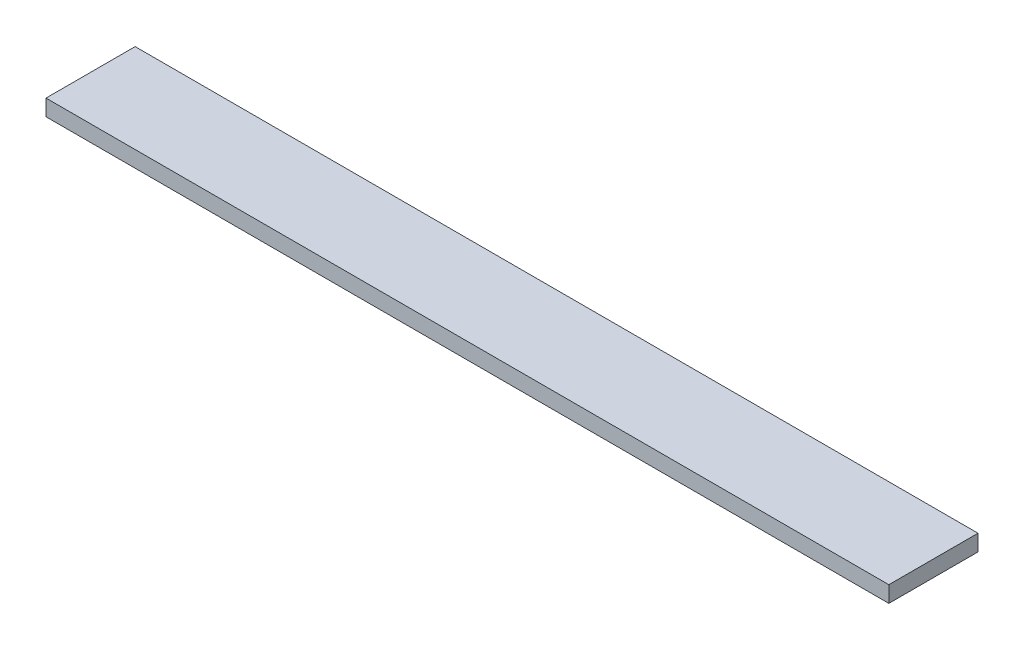
ISO-10303-21;
HEADER;
FILE_DESCRIPTION(('STEP AP214'),'2;1');
FILE_NAME('part.step','',(''),(''),'','','');
FILE_SCHEMA(('AUTOMOTIVE_DESIGN { 1 0 10303 214 1 1 1 1 }'));
ENDSEC;
DATA;
#1=APPLICATION_CONTEXT('core data for automotive mechanical design processes');
#2=APPLICATION_PROTOCOL_DEFINITION('international standard','automotive_design',2000,#1);
#3=PRODUCT_CONTEXT('',#1,'mechanical');
#4=PRODUCT('Part','Part','',(#3));
#5=PRODUCT_RELATED_PRODUCT_CATEGORY('part','',(#4));
#6=PRODUCT_DEFINITION_FORMATION('','',#4);
#7=PRODUCT_DEFINITION_CONTEXT('part definition',#1,'design');
#8=PRODUCT_DEFINITION('design','',#6,#7);
#9=PRODUCT_DEFINITION_SHAPE('','',#8);
#10=(LENGTH_UNIT() NAMED_UNIT(*) SI_UNIT(.MILLI.,.METRE.));
#11=(NAMED_UNIT(*) PLANE_ANGLE_UNIT() SI_UNIT($,.RADIAN.));
#12=(NAMED_UNIT(*) SI_UNIT($,.STERADIAN.) SOLID_ANGLE_UNIT());
#13=UNCERTAINTY_MEASURE_WITH_UNIT(LENGTH_MEASURE(1.E-05),#10,'distance_accuracy_value','');
#14=(GEOMETRIC_REPRESENTATION_CONTEXT(3) GLOBAL_UNCERTAINTY_ASSIGNED_CONTEXT((#13)) GLOBAL_UNIT_ASSIGNED_CONTEXT((#10,
#11,#12)) REPRESENTATION_CONTEXT('',''));
#15=CARTESIAN_POINT('',(0.,0.,0.));
#16=DIRECTION('',(0.,0.,1.));
#17=DIRECTION('',(1.,0.,0.));
#18=AXIS2_PLACEMENT_3D('',#15,#16,#17);
#19=CARTESIAN_POINT('',(26.,1.,2.75));
#20=DIRECTION('',(-1.,0.,0.));
#21=DIRECTION('',(0.,0.,1.));
#22=AXIS2_PLACEMENT_3D('',#19,#20,#21);
#23=PLANE('',#22);
#24=DIRECTION('',(0.,0.,-1.));
#25=VECTOR('',#24,1.);
#26=CARTESIAN_POINT('',(26.,0.,2.75));
#27=LINE('',#26,#25);
#28=CARTESIAN_POINT('',(26.,0.,2.75));
#29=VERTEX_POINT('',#28);
#30=CARTESIAN_POINT('',(26.,0.,-2.75));
#31=VERTEX_POINT('',#30);
#32=EDGE_CURVE('E107',#29,#31,#27,.T.);
#33=ORIENTED_EDGE('',*,*,#32,.T.);
#34=DIRECTION('',(0.,-1.,0.));
#35=VECTOR('',#34,1.);
#36=CARTESIAN_POINT('',(26.,1.,-2.75));
#37=LINE('',#36,#35);
#38=CARTESIAN_POINT('',(26.,1.,-2.75));
#39=VERTEX_POINT('',#38);
#40=EDGE_CURVE('E11',#39,#31,#37,.T.);
#41=ORIENTED_EDGE('',*,*,#40,.F.);
#42=DIRECTION('',(0.,0.,-1.));
#43=VECTOR('',#42,1.);
#44=CARTESIAN_POINT('',(26.,1.,2.75));
#45=LINE('',#44,#43);
#46=CARTESIAN_POINT('',(26.,1.,2.75));
#47=VERTEX_POINT('',#46);
#48=EDGE_CURVE('E91',#47,#39,#45,.T.);
#49=ORIENTED_EDGE('',*,*,#48,.F.);
#50=DIRECTION('',(0.,-1.,0.));
#51=VECTOR('',#50,1.);
#52=CARTESIAN_POINT('',(26.,1.,2.75));
#53=LINE('',#52,#51);
#54=EDGE_CURVE('E103',#47,#29,#53,.T.);
#55=ORIENTED_EDGE('',*,*,#54,.T.);
#56=EDGE_LOOP('',(#33,#41,#49,#55));
#57=FACE_BOUND('',#56,.T.);
#58=ADVANCED_FACE('F39',(#57),#23,.F.);
#59=CARTESIAN_POINT('',(-26.,1.,-2.75));
#60=DIRECTION('',(0.,0.,1.));
#61=DIRECTION('',(1.,0.,0.));
#62=AXIS2_PLACEMENT_3D('',#59,#60,#61);
#63=PLANE('',#62);
#64=DIRECTION('',(-1.,0.,0.));
#65=VECTOR('',#64,1.);
#66=CARTESIAN_POINT('',(-26.,0.,-2.75));
#67=LINE('',#66,#65);
#68=CARTESIAN_POINT('',(-26.,0.,-2.75));
#69=VERTEX_POINT('',#68);
#70=EDGE_CURVE('E96',#31,#69,#67,.T.);
#71=ORIENTED_EDGE('',*,*,#70,.T.);
#72=DIRECTION('',(0.,-1.,0.));
#73=VECTOR('',#72,1.);
#74=CARTESIAN_POINT('',(-26.,1.,-2.75));
#75=LINE('',#74,#73);
#76=CARTESIAN_POINT('',(-26.,1.,-2.75));
#77=VERTEX_POINT('',#76);
#78=EDGE_CURVE('E48',#77,#69,#75,.T.);
#79=ORIENTED_EDGE('',*,*,#78,.F.);
#80=DIRECTION('',(-1.,0.,0.));
#81=VECTOR('',#80,1.);
#82=CARTESIAN_POINT('',(-26.,1.,-2.75));
#83=LINE('',#82,#81);
#84=EDGE_CURVE('E86',#39,#77,#83,.T.);
#85=ORIENTED_EDGE('',*,*,#84,.F.);
#86=ORIENTED_EDGE('',*,*,#40,.T.);
#87=EDGE_LOOP('',(#71,#79,#85,#86));
#88=FACE_BOUND('',#87,.T.);
#89=ADVANCED_FACE('F95',(#88),#63,.F.);
#90=CARTESIAN_POINT('',(-26.,1.,2.75));
#91=DIRECTION('',(1.,0.,0.));
#92=DIRECTION('',(0.,0.,-1.));
#93=AXIS2_PLACEMENT_3D('',#90,#91,#92);
#94=PLANE('',#93);
#95=DIRECTION('',(0.,0.,1.));
#96=VECTOR('',#95,1.);
#97=CARTESIAN_POINT('',(-26.,0.,2.75));
#98=LINE('',#97,#96);
#99=CARTESIAN_POINT('',(-26.,0.,2.75));
#100=VERTEX_POINT('',#99);
#101=EDGE_CURVE('E73',#69,#100,#98,.T.);
#102=ORIENTED_EDGE('',*,*,#101,.T.);
#103=DIRECTION('',(0.,-1.,0.));
#104=VECTOR('',#103,1.);
#105=CARTESIAN_POINT('',(-26.,1.,2.75));
#106=LINE('',#105,#104);
#107=CARTESIAN_POINT('',(-26.,1.,2.75));
#108=VERTEX_POINT('',#107);
#109=EDGE_CURVE('E98',#108,#100,#106,.T.);
#110=ORIENTED_EDGE('',*,*,#109,.F.);
#111=DIRECTION('',(0.,0.,1.));
#112=VECTOR('',#111,1.);
#113=CARTESIAN_POINT('',(-26.,1.,2.75));
#114=LINE('',#113,#112);
#115=EDGE_CURVE('E89',#77,#108,#114,.T.);
#116=ORIENTED_EDGE('',*,*,#115,.F.);
#117=ORIENTED_EDGE('',*,*,#78,.T.);
#118=EDGE_LOOP('',(#102,#110,#116,#117));
#119=FACE_BOUND('',#118,.T.);
#120=ADVANCED_FACE('F99',(#119),#94,.F.);
#121=CARTESIAN_POINT('',(-26.,1.,2.75));
#122=DIRECTION('',(0.,0.,-1.));
#123=DIRECTION('',(-1.,0.,0.));
#124=AXIS2_PLACEMENT_3D('',#121,#122,#123);
#125=PLANE('',#124);
#126=DIRECTION('',(1.,0.,0.));
#127=VECTOR('',#126,1.);
#128=CARTESIAN_POINT('',(-26.,0.,2.75));
#129=LINE('',#128,#127);
#130=EDGE_CURVE('E79',#100,#29,#129,.T.);
#131=ORIENTED_EDGE('',*,*,#130,.T.);
#132=ORIENTED_EDGE('',*,*,#54,.F.);
#133=DIRECTION('',(1.,0.,0.));
#134=VECTOR('',#133,1.);
#135=CARTESIAN_POINT('',(-26.,1.,2.75));
#136=LINE('',#135,#134);
#137=EDGE_CURVE('E56',#108,#47,#136,.T.);
#138=ORIENTED_EDGE('',*,*,#137,.F.);
#139=ORIENTED_EDGE('',*,*,#109,.T.);
#140=EDGE_LOOP('',(#131,#132,#138,#139));
#141=FACE_BOUND('',#140,.T.);
#142=ADVANCED_FACE('F120',(#141),#125,.F.);
#143=CARTESIAN_POINT('',(0.,1.,0.));
#144=DIRECTION('',(0.,-1.,0.));
#145=DIRECTION('',(0.,0.,-1.));
#146=AXIS2_PLACEMENT_3D('',#143,#144,#145);
#147=PLANE('',#146);
#148=ORIENTED_EDGE('',*,*,#48,.T.);
#149=ORIENTED_EDGE('',*,*,#84,.T.);
#150=ORIENTED_EDGE('',*,*,#115,.T.);
#151=ORIENTED_EDGE('',*,*,#137,.T.);
#152=EDGE_LOOP('',(#148,#149,#150,#151));
#153=FACE_BOUND('',#152,.T.);
#154=ADVANCED_FACE('F87',(#153),#147,.F.);
#155=CARTESIAN_POINT('',(0.,0.,0.));
#156=DIRECTION('',(0.,-1.,0.));
#157=DIRECTION('',(0.,0.,-1.));
#158=AXIS2_PLACEMENT_3D('',#155,#156,#157);
#159=PLANE('',#158);
#160=ORIENTED_EDGE('',*,*,#32,.F.);
#161=ORIENTED_EDGE('',*,*,#130,.F.);
#162=ORIENTED_EDGE('',*,*,#101,.F.);
#163=ORIENTED_EDGE('',*,*,#70,.F.);
#164=EDGE_LOOP('',(#160,#161,#162,#163));
#165=FACE_BOUND('',#164,.T.);
#166=ADVANCED_FACE('F123',(#165),#159,.T.);
#167=CLOSED_SHELL('',(#58,#89,#120,#142,#154,#166));
#168=MANIFOLD_SOLID_BREP('B2',#167);
#169=ADVANCED_BREP_SHAPE_REPRESENTATION('',(#18,#168),#14);
#170=SHAPE_DEFINITION_REPRESENTATION(#9,#169);
ENDSEC;
END-ISO-10303-21;
